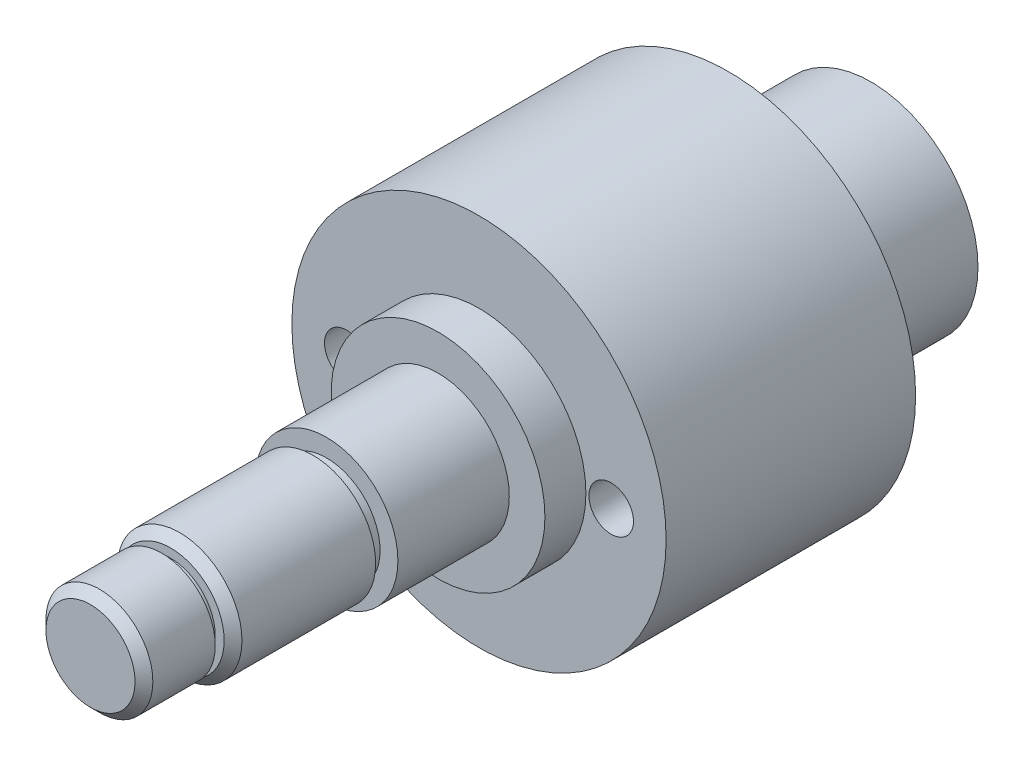
ISO-10303-21;
HEADER;
FILE_DESCRIPTION(('STEP AP214'),'2;1');
FILE_NAME('part.step','',(''),(''),'','','');
FILE_SCHEMA(('AUTOMOTIVE_DESIGN { 1 0 10303 214 1 1 1 1 }'));
ENDSEC;
DATA;
#1=APPLICATION_CONTEXT('core data for automotive mechanical design processes');
#2=APPLICATION_PROTOCOL_DEFINITION('international standard','automotive_design',2000,#1);
#3=PRODUCT_CONTEXT('',#1,'mechanical');
#4=PRODUCT('Part','Part','',(#3));
#5=PRODUCT_RELATED_PRODUCT_CATEGORY('part','',(#4));
#6=PRODUCT_DEFINITION_FORMATION('','',#4);
#7=PRODUCT_DEFINITION_CONTEXT('part definition',#1,'design');
#8=PRODUCT_DEFINITION('design','',#6,#7);
#9=PRODUCT_DEFINITION_SHAPE('','',#8);
#10=(LENGTH_UNIT() NAMED_UNIT(*) SI_UNIT(.MILLI.,.METRE.));
#11=(NAMED_UNIT(*) PLANE_ANGLE_UNIT() SI_UNIT($,.RADIAN.));
#12=(NAMED_UNIT(*) SI_UNIT($,.STERADIAN.) SOLID_ANGLE_UNIT());
#13=UNCERTAINTY_MEASURE_WITH_UNIT(LENGTH_MEASURE(1.E-05),#10,'distance_accuracy_value','');
#14=(GEOMETRIC_REPRESENTATION_CONTEXT(3) GLOBAL_UNCERTAINTY_ASSIGNED_CONTEXT((#13)) GLOBAL_UNIT_ASSIGNED_CONTEXT((#10,
#11,#12)) REPRESENTATION_CONTEXT('',''));
#15=CARTESIAN_POINT('',(0.,0.,0.));
#16=DIRECTION('',(0.,0.,1.));
#17=DIRECTION('',(1.,0.,0.));
#18=AXIS2_PLACEMENT_3D('',#15,#16,#17);
#19=CARTESIAN_POINT('',(0.,0.,8.));
#20=DIRECTION('',(0.,0.,-1.));
#21=DIRECTION('',(-1.,0.,0.));
#22=AXIS2_PLACEMENT_3D('',#19,#20,#21);
#23=CYLINDRICAL_SURFACE('',#22,6.);
#24=CARTESIAN_POINT('',(0.,0.,8.));
#25=DIRECTION('',(0.,0.,1.));
#26=DIRECTION('',(1.,0.,0.));
#27=AXIS2_PLACEMENT_3D('',#24,#25,#26);
#28=CIRCLE('',#27,6.);
#29=CARTESIAN_POINT('',(6.,0.,8.));
#30=VERTEX_POINT('',#29);
#31=EDGE_CURVE('E67',#30,#30,#28,.T.);
#32=ORIENTED_EDGE('',*,*,#31,.F.);
#33=EDGE_LOOP('',(#32));
#34=FACE_BOUND('',#33,.T.);
#35=CARTESIAN_POINT('',(0.,0.,0.));
#36=DIRECTION('',(0.,0.,1.));
#37=DIRECTION('',(1.,0.,0.));
#38=AXIS2_PLACEMENT_3D('',#35,#36,#37);
#39=CIRCLE('',#38,6.);
#40=CARTESIAN_POINT('',(6.,0.,0.));
#41=VERTEX_POINT('',#40);
#42=EDGE_CURVE('E64',#41,#41,#39,.T.);
#43=ORIENTED_EDGE('',*,*,#42,.T.);
#44=EDGE_LOOP('',(#43));
#45=FACE_BOUND('',#44,.T.);
#46=ADVANCED_FACE('F42',(#34,#45),#23,.T.);
#47=CARTESIAN_POINT('',(0.,0.,0.));
#48=DIRECTION('',(0.,0.,1.));
#49=DIRECTION('',(1.,0.,0.));
#50=AXIS2_PLACEMENT_3D('',#47,#48,#49);
#51=PLANE('',#50);
#52=CARTESIAN_POINT('',(0.,0.,0.));
#53=DIRECTION('',(0.,0.,-1.));
#54=DIRECTION('',(-1.,0.,0.));
#55=AXIS2_PLACEMENT_3D('',#52,#53,#54);
#56=CIRCLE('',#55,4.75);
#57=CARTESIAN_POINT('',(-4.75,0.,0.));
#58=VERTEX_POINT('',#57);
#59=EDGE_CURVE('E118',#58,#58,#56,.T.);
#60=ORIENTED_EDGE('',*,*,#59,.F.);
#61=EDGE_LOOP('',(#60));
#62=FACE_BOUND('',#61,.T.);
#63=ORIENTED_EDGE('',*,*,#42,.F.);
#64=EDGE_LOOP('',(#63));
#65=FACE_BOUND('',#64,.T.);
#66=ADVANCED_FACE('F133',(#62,#65),#51,.F.);
#67=CARTESIAN_POINT('',(0.,0.,22.));
#68=DIRECTION('',(0.,0.,1.));
#69=DIRECTION('',(1.,0.,0.));
#70=AXIS2_PLACEMENT_3D('',#67,#68,#69);
#71=PLANE('',#70);
#72=CARTESIAN_POINT('',(0.,0.,22.));
#73=DIRECTION('',(0.,0.,1.));
#74=DIRECTION('',(1.,0.,0.));
#75=AXIS2_PLACEMENT_3D('',#72,#73,#74);
#76=CIRCLE('',#75,6.);
#77=CARTESIAN_POINT('',(6.,0.,22.));
#78=VERTEX_POINT('',#77);
#79=EDGE_CURVE('E90',#78,#78,#76,.T.);
#80=ORIENTED_EDGE('',*,*,#79,.F.);
#81=EDGE_LOOP('',(#80));
#82=FACE_BOUND('',#81,.T.);
#83=CARTESIAN_POINT('',(-7.41856783886479,-0.0265898488848205,22.));
#84=DIRECTION('',(0.,0.,1.));
#85=DIRECTION('',(1.,0.,0.));
#86=AXIS2_PLACEMENT_3D('',#83,#84,#85);
#87=CIRCLE('',#86,1.25);
#88=CARTESIAN_POINT('',(-6.16856783886479,-0.0265898488848205,22.));
#89=VERTEX_POINT('',#88);
#90=EDGE_CURVE('E75',#89,#89,#87,.T.);
#91=ORIENTED_EDGE('',*,*,#90,.F.);
#92=EDGE_LOOP('',(#91));
#93=FACE_BOUND('',#92,.T.);
#94=CARTESIAN_POINT('',(0.,0.,22.));
#95=DIRECTION('',(0.,0.,1.));
#96=DIRECTION('',(1.,0.,0.));
#97=AXIS2_PLACEMENT_3D('',#94,#95,#96);
#98=CIRCLE('',#97,10.5);
#99=CARTESIAN_POINT('',(10.5,0.,22.));
#100=VERTEX_POINT('',#99);
#101=EDGE_CURVE('E68',#100,#100,#98,.T.);
#102=ORIENTED_EDGE('',*,*,#101,.T.);
#103=EDGE_LOOP('',(#102));
#104=FACE_BOUND('',#103,.T.);
#105=CARTESIAN_POINT('',(7.41856783886479,-0.0265898488848188,22.));
#106=DIRECTION('',(0.,0.,1.));
#107=DIRECTION('',(1.,0.,0.));
#108=AXIS2_PLACEMENT_3D('',#105,#106,#107);
#109=CIRCLE('',#108,1.25);
#110=CARTESIAN_POINT('',(8.66856783886479,-0.0265898488848188,22.));
#111=VERTEX_POINT('',#110);
#112=EDGE_CURVE('E81',#111,#111,#109,.T.);
#113=ORIENTED_EDGE('',*,*,#112,.F.);
#114=EDGE_LOOP('',(#113));
#115=FACE_BOUND('',#114,.T.);
#116=ADVANCED_FACE('F136',(#82,#93,#104,#115),#71,.T.);
#117=CARTESIAN_POINT('',(0.,0.,8.));
#118=DIRECTION('',(0.,0.,1.));
#119=DIRECTION('',(1.,0.,0.));
#120=AXIS2_PLACEMENT_3D('',#117,#118,#119);
#121=PLANE('',#120);
#122=ORIENTED_EDGE('',*,*,#31,.T.);
#123=EDGE_LOOP('',(#122));
#124=FACE_BOUND('',#123,.T.);
#125=CARTESIAN_POINT('',(0.,0.,8.));
#126=DIRECTION('',(0.,0.,1.));
#127=DIRECTION('',(1.,0.,0.));
#128=AXIS2_PLACEMENT_3D('',#125,#126,#127);
#129=CIRCLE('',#128,10.5);
#130=CARTESIAN_POINT('',(10.5,0.,8.));
#131=VERTEX_POINT('',#130);
#132=EDGE_CURVE('E72',#131,#131,#129,.T.);
#133=ORIENTED_EDGE('',*,*,#132,.F.);
#134=EDGE_LOOP('',(#133));
#135=FACE_BOUND('',#134,.T.);
#136=CARTESIAN_POINT('',(-7.41856783886479,-0.0265898488848205,8.));
#137=DIRECTION('',(0.,0.,1.));
#138=DIRECTION('',(1.,0.,0.));
#139=AXIS2_PLACEMENT_3D('',#136,#137,#138);
#140=CIRCLE('',#139,1.25);
#141=CARTESIAN_POINT('',(-6.16856783886479,-0.0265898488848205,8.));
#142=VERTEX_POINT('',#141);
#143=EDGE_CURVE('E78',#142,#142,#140,.T.);
#144=ORIENTED_EDGE('',*,*,#143,.T.);
#145=EDGE_LOOP('',(#144));
#146=FACE_BOUND('',#145,.T.);
#147=CARTESIAN_POINT('',(7.41856783886479,-0.0265898488848188,8.));
#148=DIRECTION('',(0.,0.,1.));
#149=DIRECTION('',(1.,0.,0.));
#150=AXIS2_PLACEMENT_3D('',#147,#148,#149);
#151=CIRCLE('',#150,1.25);
#152=CARTESIAN_POINT('',(8.66856783886479,-0.0265898488848188,8.));
#153=VERTEX_POINT('',#152);
#154=EDGE_CURVE('E84',#153,#153,#151,.T.);
#155=ORIENTED_EDGE('',*,*,#154,.T.);
#156=EDGE_LOOP('',(#155));
#157=FACE_BOUND('',#156,.T.);
#158=ADVANCED_FACE('F223',(#124,#135,#146,#157),#121,.F.);
#159=CARTESIAN_POINT('',(0.,0.,22.));
#160=DIRECTION('',(0.,0.,-1.));
#161=DIRECTION('',(-1.,0.,0.));
#162=AXIS2_PLACEMENT_3D('',#159,#160,#161);
#163=CYLINDRICAL_SURFACE('',#162,10.5);
#164=ORIENTED_EDGE('',*,*,#101,.F.);
#165=EDGE_LOOP('',(#164));
#166=FACE_BOUND('',#165,.T.);
#167=ORIENTED_EDGE('',*,*,#132,.T.);
#168=EDGE_LOOP('',(#167));
#169=FACE_BOUND('',#168,.T.);
#170=ADVANCED_FACE('F219',(#166,#169),#163,.T.);
#171=CARTESIAN_POINT('',(-7.41856783886479,-0.0265898488848205,22.));
#172=DIRECTION('',(0.,0.,-1.));
#173=DIRECTION('',(-1.,0.,0.));
#174=AXIS2_PLACEMENT_3D('',#171,#172,#173);
#175=CYLINDRICAL_SURFACE('',#174,1.25);
#176=ORIENTED_EDGE('',*,*,#90,.T.);
#177=EDGE_LOOP('',(#176));
#178=FACE_BOUND('',#177,.T.);
#179=ORIENTED_EDGE('',*,*,#143,.F.);
#180=EDGE_LOOP('',(#179));
#181=FACE_BOUND('',#180,.T.);
#182=ADVANCED_FACE('F215',(#178,#181),#175,.F.);
#183=CARTESIAN_POINT('',(7.41856783886479,-0.0265898488848188,22.));
#184=DIRECTION('',(0.,0.,-1.));
#185=DIRECTION('',(-1.,0.,0.));
#186=AXIS2_PLACEMENT_3D('',#183,#184,#185);
#187=CYLINDRICAL_SURFACE('',#186,1.25);
#188=ORIENTED_EDGE('',*,*,#112,.T.);
#189=EDGE_LOOP('',(#188));
#190=FACE_BOUND('',#189,.T.);
#191=ORIENTED_EDGE('',*,*,#154,.F.);
#192=EDGE_LOOP('',(#191));
#193=FACE_BOUND('',#192,.T.);
#194=ADVANCED_FACE('F211',(#190,#193),#187,.F.);
#195=CARTESIAN_POINT('',(0.,0.,24.3));
#196=DIRECTION('',(0.,0.,-1.));
#197=DIRECTION('',(-1.,0.,0.));
#198=AXIS2_PLACEMENT_3D('',#195,#196,#197);
#199=CYLINDRICAL_SURFACE('',#198,6.);
#200=CARTESIAN_POINT('',(0.,0.,24.3));
#201=DIRECTION('',(0.,0.,1.));
#202=DIRECTION('',(1.,0.,0.));
#203=AXIS2_PLACEMENT_3D('',#200,#201,#202);
#204=CIRCLE('',#203,6.);
#205=CARTESIAN_POINT('',(6.,0.,24.3));
#206=VERTEX_POINT('',#205);
#207=EDGE_CURVE('E87',#206,#206,#204,.T.);
#208=ORIENTED_EDGE('',*,*,#207,.F.);
#209=EDGE_LOOP('',(#208));
#210=FACE_BOUND('',#209,.T.);
#211=ORIENTED_EDGE('',*,*,#79,.T.);
#212=EDGE_LOOP('',(#211));
#213=FACE_BOUND('',#212,.T.);
#214=ADVANCED_FACE('F207',(#210,#213),#199,.T.);
#215=CARTESIAN_POINT('',(0.,0.,24.3));
#216=DIRECTION('',(0.,0.,1.));
#217=DIRECTION('',(1.,0.,0.));
#218=AXIS2_PLACEMENT_3D('',#215,#216,#217);
#219=PLANE('',#218);
#220=CARTESIAN_POINT('',(0.,0.,24.3));
#221=DIRECTION('',(0.,0.,1.));
#222=DIRECTION('',(1.,0.,0.));
#223=AXIS2_PLACEMENT_3D('',#220,#221,#222);
#224=CIRCLE('',#223,4.);
#225=CARTESIAN_POINT('',(4.,0.,24.3));
#226=VERTEX_POINT('',#225);
#227=EDGE_CURVE('E71',#226,#226,#224,.T.);
#228=ORIENTED_EDGE('',*,*,#227,.F.);
#229=EDGE_LOOP('',(#228));
#230=FACE_BOUND('',#229,.T.);
#231=ORIENTED_EDGE('',*,*,#207,.T.);
#232=EDGE_LOOP('',(#231));
#233=FACE_BOUND('',#232,.T.);
#234=ADVANCED_FACE('F203',(#230,#233),#219,.T.);
#235=CARTESIAN_POINT('',(0.,0.,30.55));
#236=DIRECTION('',(0.,0.,-1.));
#237=DIRECTION('',(-1.,0.,0.));
#238=AXIS2_PLACEMENT_3D('',#235,#236,#237);
#239=CYLINDRICAL_SURFACE('',#238,4.);
#240=CARTESIAN_POINT('',(0.,0.,30.55));
#241=DIRECTION('',(0.,0.,1.));
#242=DIRECTION('',(1.,0.,0.));
#243=AXIS2_PLACEMENT_3D('',#240,#241,#242);
#244=CIRCLE('',#243,4.);
#245=CARTESIAN_POINT('',(4.,0.,30.55));
#246=VERTEX_POINT('',#245);
#247=EDGE_CURVE('E93',#246,#246,#244,.T.);
#248=ORIENTED_EDGE('',*,*,#247,.F.);
#249=EDGE_LOOP('',(#248));
#250=FACE_BOUND('',#249,.T.);
#251=ORIENTED_EDGE('',*,*,#227,.T.);
#252=EDGE_LOOP('',(#251));
#253=FACE_BOUND('',#252,.T.);
#254=ADVANCED_FACE('F199',(#250,#253),#239,.T.);
#255=CARTESIAN_POINT('',(0.,0.,30.55));
#256=DIRECTION('',(0.,0.,1.));
#257=DIRECTION('',(1.,0.,0.));
#258=AXIS2_PLACEMENT_3D('',#255,#256,#257);
#259=PLANE('',#258);
#260=CARTESIAN_POINT('',(0.,0.,30.55));
#261=DIRECTION('',(0.,0.,1.));
#262=DIRECTION('',(1.,0.,0.));
#263=AXIS2_PLACEMENT_3D('',#260,#261,#262);
#264=CIRCLE('',#263,3.);
#265=CARTESIAN_POINT('',(3.,0.,30.55));
#266=VERTEX_POINT('',#265);
#267=EDGE_CURVE('E98',#266,#266,#264,.T.);
#268=ORIENTED_EDGE('',*,*,#267,.F.);
#269=EDGE_LOOP('',(#268));
#270=FACE_BOUND('',#269,.T.);
#271=ORIENTED_EDGE('',*,*,#247,.T.);
#272=EDGE_LOOP('',(#271));
#273=FACE_BOUND('',#272,.T.);
#274=ADVANCED_FACE('F195',(#270,#273),#259,.T.);
#275=CARTESIAN_POINT('',(0.,0.,31.3));
#276=DIRECTION('',(0.,0.,-1.));
#277=DIRECTION('',(-1.,0.,0.));
#278=AXIS2_PLACEMENT_3D('',#275,#276,#277);
#279=CYLINDRICAL_SURFACE('',#278,3.);
#280=CARTESIAN_POINT('',(0.,0.,31.3));
#281=DIRECTION('',(0.,0.,1.));
#282=DIRECTION('',(1.,0.,0.));
#283=AXIS2_PLACEMENT_3D('',#280,#281,#282);
#284=CIRCLE('',#283,3.);
#285=CARTESIAN_POINT('',(3.,0.,31.3));
#286=VERTEX_POINT('',#285);
#287=EDGE_CURVE('E101',#286,#286,#284,.T.);
#288=ORIENTED_EDGE('',*,*,#287,.F.);
#289=EDGE_LOOP('',(#288));
#290=FACE_BOUND('',#289,.T.);
#291=ORIENTED_EDGE('',*,*,#267,.T.);
#292=EDGE_LOOP('',(#291));
#293=FACE_BOUND('',#292,.T.);
#294=ADVANCED_FACE('F191',(#290,#293),#279,.T.);
#295=CARTESIAN_POINT('',(0.,0.,39.3));
#296=DIRECTION('',(0.,0.,-1.));
#297=DIRECTION('',(-1.,0.,0.));
#298=AXIS2_PLACEMENT_3D('',#295,#296,#297);
#299=CYLINDRICAL_SURFACE('',#298,3.5);
#300=CARTESIAN_POINT('',(0.,0.,38.8));
#301=DIRECTION('',(0.,0.,1.));
#302=DIRECTION('',(1.,0.,0.));
#303=AXIS2_PLACEMENT_3D('',#300,#301,#302);
#304=CIRCLE('',#303,3.5);
#305=CARTESIAN_POINT('',(3.5,0.,38.8));
#306=VERTEX_POINT('',#305);
#307=EDGE_CURVE('E54',#306,#306,#304,.F.);
#308=ORIENTED_EDGE('',*,*,#307,.T.);
#309=EDGE_LOOP('',(#308));
#310=FACE_BOUND('',#309,.T.);
#311=CARTESIAN_POINT('',(0.,0.,31.3));
#312=DIRECTION('',(0.,0.,1.));
#313=DIRECTION('',(1.,0.,0.));
#314=AXIS2_PLACEMENT_3D('',#311,#312,#313);
#315=CIRCLE('',#314,3.5);
#316=CARTESIAN_POINT('',(3.5,0.,31.3));
#317=VERTEX_POINT('',#316);
#318=EDGE_CURVE('E106',#317,#317,#315,.T.);
#319=ORIENTED_EDGE('',*,*,#318,.T.);
#320=EDGE_LOOP('',(#319));
#321=FACE_BOUND('',#320,.T.);
#322=ADVANCED_FACE('F169',(#310,#321),#299,.T.);
#323=CARTESIAN_POINT('',(0.,0.,39.3));
#324=DIRECTION('',(0.,0.,1.));
#325=DIRECTION('',(1.,0.,0.));
#326=AXIS2_PLACEMENT_3D('',#323,#324,#325);
#327=PLANE('',#326);
#328=CARTESIAN_POINT('',(0.,0.,39.3));
#329=DIRECTION('',(0.,0.,1.));
#330=DIRECTION('',(1.,0.,0.));
#331=AXIS2_PLACEMENT_3D('',#328,#329,#330);
#332=CIRCLE('',#331,3.);
#333=CARTESIAN_POINT('',(3.,0.,39.3));
#334=VERTEX_POINT('',#333);
#335=EDGE_CURVE('E58',#334,#334,#332,.T.);
#336=ORIENTED_EDGE('',*,*,#335,.T.);
#337=EDGE_LOOP('',(#336));
#338=FACE_BOUND('',#337,.T.);
#339=CARTESIAN_POINT('',(0.,0.,39.3));
#340=DIRECTION('',(0.,0.,1.));
#341=DIRECTION('',(1.,0.,0.));
#342=AXIS2_PLACEMENT_3D('',#339,#340,#341);
#343=CIRCLE('',#342,2.5);
#344=CARTESIAN_POINT('',(2.5,0.,39.3));
#345=VERTEX_POINT('',#344);
#346=EDGE_CURVE('E63',#345,#345,#343,.T.);
#347=ORIENTED_EDGE('',*,*,#346,.F.);
#348=EDGE_LOOP('',(#347));
#349=FACE_BOUND('',#348,.T.);
#350=ADVANCED_FACE('F166',(#338,#349),#327,.T.);
#351=CARTESIAN_POINT('',(0.,0.,31.3));
#352=DIRECTION('',(0.,0.,1.));
#353=DIRECTION('',(1.,0.,0.));
#354=AXIS2_PLACEMENT_3D('',#351,#352,#353);
#355=PLANE('',#354);
#356=ORIENTED_EDGE('',*,*,#287,.T.);
#357=EDGE_LOOP('',(#356));
#358=FACE_BOUND('',#357,.T.);
#359=ORIENTED_EDGE('',*,*,#318,.F.);
#360=EDGE_LOOP('',(#359));
#361=FACE_BOUND('',#360,.T.);
#362=ADVANCED_FACE('F168',(#358,#361),#355,.F.);
#363=CARTESIAN_POINT('',(0.,0.,39.8));
#364=DIRECTION('',(0.,0.,-1.));
#365=DIRECTION('',(-1.,0.,0.));
#366=AXIS2_PLACEMENT_3D('',#363,#364,#365);
#367=CYLINDRICAL_SURFACE('',#366,2.5);
#368=CARTESIAN_POINT('',(0.,0.,39.8));
#369=DIRECTION('',(0.,0.,1.));
#370=DIRECTION('',(1.,0.,0.));
#371=AXIS2_PLACEMENT_3D('',#368,#369,#370);
#372=CIRCLE('',#371,2.5);
#373=CARTESIAN_POINT('',(2.5,0.,39.8));
#374=VERTEX_POINT('',#373);
#375=EDGE_CURVE('E109',#374,#374,#372,.T.);
#376=ORIENTED_EDGE('',*,*,#375,.F.);
#377=EDGE_LOOP('',(#376));
#378=FACE_BOUND('',#377,.T.);
#379=ORIENTED_EDGE('',*,*,#346,.T.);
#380=EDGE_LOOP('',(#379));
#381=FACE_BOUND('',#380,.T.);
#382=ADVANCED_FACE('F173',(#378,#381),#367,.T.);
#383=CARTESIAN_POINT('',(0.,0.,43.8));
#384=DIRECTION('',(0.,0.,-1.));
#385=DIRECTION('',(-1.,0.,0.));
#386=AXIS2_PLACEMENT_3D('',#383,#384,#385);
#387=CYLINDRICAL_SURFACE('',#386,3.);
#388=CARTESIAN_POINT('',(0.,0.,43.3));
#389=DIRECTION('',(0.,0.,1.));
#390=DIRECTION('',(1.,0.,0.));
#391=AXIS2_PLACEMENT_3D('',#388,#389,#390);
#392=CIRCLE('',#391,3.);
#393=CARTESIAN_POINT('',(3.,0.,43.3));
#394=VERTEX_POINT('',#393);
#395=EDGE_CURVE('E10',#394,#394,#392,.F.);
#396=ORIENTED_EDGE('',*,*,#395,.T.);
#397=EDGE_LOOP('',(#396));
#398=FACE_BOUND('',#397,.T.);
#399=CARTESIAN_POINT('',(0.,0.,39.8));
#400=DIRECTION('',(0.,0.,1.));
#401=DIRECTION('',(1.,0.,0.));
#402=AXIS2_PLACEMENT_3D('',#399,#400,#401);
#403=CIRCLE('',#402,3.);
#404=CARTESIAN_POINT('',(3.,0.,39.8));
#405=VERTEX_POINT('',#404);
#406=EDGE_CURVE('E114',#405,#405,#403,.T.);
#407=ORIENTED_EDGE('',*,*,#406,.T.);
#408=EDGE_LOOP('',(#407));
#409=FACE_BOUND('',#408,.T.);
#410=ADVANCED_FACE('F175',(#398,#409),#387,.T.);
#411=CARTESIAN_POINT('',(0.,0.,43.8));
#412=DIRECTION('',(0.,0.,1.));
#413=DIRECTION('',(1.,0.,0.));
#414=AXIS2_PLACEMENT_3D('',#411,#412,#413);
#415=PLANE('',#414);
#416=CARTESIAN_POINT('',(0.,0.,43.8));
#417=DIRECTION('',(0.,0.,1.));
#418=DIRECTION('',(1.,0.,0.));
#419=AXIS2_PLACEMENT_3D('',#416,#417,#418);
#420=CIRCLE('',#419,2.5);
#421=CARTESIAN_POINT('',(2.5,0.,43.8));
#422=VERTEX_POINT('',#421);
#423=EDGE_CURVE('E50',#422,#422,#420,.T.);
#424=ORIENTED_EDGE('',*,*,#423,.T.);
#425=EDGE_LOOP('',(#424));
#426=FACE_BOUND('',#425,.T.);
#427=ADVANCED_FACE('F182',(#426),#415,.T.);
#428=CARTESIAN_POINT('',(0.,0.,39.8));
#429=DIRECTION('',(0.,0.,1.));
#430=DIRECTION('',(1.,0.,0.));
#431=AXIS2_PLACEMENT_3D('',#428,#429,#430);
#432=PLANE('',#431);
#433=ORIENTED_EDGE('',*,*,#375,.T.);
#434=EDGE_LOOP('',(#433));
#435=FACE_BOUND('',#434,.T.);
#436=ORIENTED_EDGE('',*,*,#406,.F.);
#437=EDGE_LOOP('',(#436));
#438=FACE_BOUND('',#437,.T.);
#439=ADVANCED_FACE('F129',(#435,#438),#432,.F.);
#440=CARTESIAN_POINT('',(0.,0.,21.));
#441=DIRECTION('',(0.,0.,-1.));
#442=DIRECTION('',(-1.,0.,0.));
#443=AXIS2_PLACEMENT_3D('',#440,#441,#442);
#444=CYLINDRICAL_SURFACE('',#443,4.75);
#445=CARTESIAN_POINT('',(0.,0.,21.));
#446=DIRECTION('',(0.,0.,-1.));
#447=DIRECTION('',(-1.,0.,0.));
#448=AXIS2_PLACEMENT_3D('',#445,#446,#447);
#449=CIRCLE('',#448,4.75);
#450=CARTESIAN_POINT('',(-4.75,0.,21.));
#451=VERTEX_POINT('',#450);
#452=EDGE_CURVE('E117',#451,#451,#449,.T.);
#453=CARTESIAN_POINT('',(-4.75,0.,21.));
#454=CARTESIAN_POINT('',(-4.75,0.,20.78125));
#455=CARTESIAN_POINT('',(-4.75,0.,20.5625));
#456=CARTESIAN_POINT('',(-4.75,0.,20.125));
#457=CARTESIAN_POINT('',(-4.75,0.,19.90625));
#458=CARTESIAN_POINT('',(-4.75,0.,19.46875));
#459=CARTESIAN_POINT('',(-4.75,0.,19.25));
#460=CARTESIAN_POINT('',(-4.75,0.,18.8125));
#461=CARTESIAN_POINT('',(-4.75,0.,18.59375));
#462=CARTESIAN_POINT('',(-4.75,0.,18.15625));
#463=CARTESIAN_POINT('',(-4.75,0.,17.9375));
#464=CARTESIAN_POINT('',(-4.75,0.,17.5));
#465=CARTESIAN_POINT('',(-4.75,0.,17.28125));
#466=CARTESIAN_POINT('',(-4.75,0.,16.84375));
#467=CARTESIAN_POINT('',(-4.75,0.,16.625));
#468=CARTESIAN_POINT('',(-4.75,0.,16.1875));
#469=CARTESIAN_POINT('',(-4.75,0.,15.96875));
#470=CARTESIAN_POINT('',(-4.75,0.,15.53125));
#471=CARTESIAN_POINT('',(-4.75,0.,15.3125));
#472=CARTESIAN_POINT('',(-4.75,0.,14.875));
#473=CARTESIAN_POINT('',(-4.75,0.,14.65625));
#474=CARTESIAN_POINT('',(-4.75,0.,14.21875));
#475=CARTESIAN_POINT('',(-4.75,0.,14.));
#476=CARTESIAN_POINT('',(-4.75,0.,13.5625));
#477=CARTESIAN_POINT('',(-4.75,0.,13.34375));
#478=CARTESIAN_POINT('',(-4.75,0.,12.90625));
#479=CARTESIAN_POINT('',(-4.75,0.,12.6875));
#480=CARTESIAN_POINT('',(-4.75,0.,12.25));
#481=CARTESIAN_POINT('',(-4.75,0.,12.03125));
#482=CARTESIAN_POINT('',(-4.75,0.,11.59375));
#483=CARTESIAN_POINT('',(-4.75,0.,11.375));
#484=CARTESIAN_POINT('',(-4.75,0.,10.9375));
#485=CARTESIAN_POINT('',(-4.75,0.,10.71875));
#486=CARTESIAN_POINT('',(-4.75,0.,10.28125));
#487=CARTESIAN_POINT('',(-4.75,0.,10.0625));
#488=CARTESIAN_POINT('',(-4.75,0.,9.625));
#489=CARTESIAN_POINT('',(-4.75,0.,9.40625));
#490=CARTESIAN_POINT('',(-4.75,0.,8.96875));
#491=CARTESIAN_POINT('',(-4.75,0.,8.75));
#492=CARTESIAN_POINT('',(-4.75,0.,8.3125));
#493=CARTESIAN_POINT('',(-4.75,0.,8.09375));
#494=CARTESIAN_POINT('',(-4.75,0.,7.65625));
#495=CARTESIAN_POINT('',(-4.75,0.,7.4375));
#496=CARTESIAN_POINT('',(-4.75,0.,7.));
#497=CARTESIAN_POINT('',(-4.75,0.,6.78125));
#498=CARTESIAN_POINT('',(-4.75,0.,6.34375));
#499=CARTESIAN_POINT('',(-4.75,0.,6.125));
#500=CARTESIAN_POINT('',(-4.75,0.,5.6875));
#501=CARTESIAN_POINT('',(-4.75,0.,5.46875));
#502=CARTESIAN_POINT('',(-4.75,0.,5.03125));
#503=CARTESIAN_POINT('',(-4.75,0.,4.8125));
#504=CARTESIAN_POINT('',(-4.75,0.,4.375));
#505=CARTESIAN_POINT('',(-4.75,0.,4.15625));
#506=CARTESIAN_POINT('',(-4.75,0.,3.71875));
#507=CARTESIAN_POINT('',(-4.75,0.,3.5));
#508=CARTESIAN_POINT('',(-4.75,0.,3.0625));
#509=CARTESIAN_POINT('',(-4.75,0.,2.84375));
#510=CARTESIAN_POINT('',(-4.75,0.,2.40625));
#511=CARTESIAN_POINT('',(-4.75,0.,2.1875));
#512=CARTESIAN_POINT('',(-4.75,0.,1.75));
#513=CARTESIAN_POINT('',(-4.75,0.,1.53125));
#514=CARTESIAN_POINT('',(-4.75,0.,1.09375));
#515=CARTESIAN_POINT('',(-4.75,0.,0.875000000000001));
#516=CARTESIAN_POINT('',(-4.75,0.,0.4375));
#517=CARTESIAN_POINT('',(-4.75,0.,0.21875));
#518=CARTESIAN_POINT('',(-4.75,0.,0.));
#519=B_SPLINE_CURVE_WITH_KNOTS('',3,(#453,#454,#455,#456,#457,#458,#459,#460,#461,#462,#463,
#464,#465,#466,#467,#468,#469,#470,#471,#472,#473,#474,#475,#476,#477,#478,#479,#480,#481,#482,
#483,#484,#485,#486,#487,#488,#489,#490,#491,#492,#493,#494,#495,#496,#497,#498,#499,#500,#501,
#502,#503,#504,#505,#506,#507,#508,#509,#510,#511,#512,#513,#514,#515,#516,#517,#518),
.UNSPECIFIED.,.F.,.F.,(4,2,2,2,2,2,2,2,2,2,2,2,2,2,2,2,2,2,2,2,2,2,2,2,2,2,2,2,2,2,2,2,4),(0.,
0.656249999999997,1.3125,1.96875,2.625,3.28125,3.9375,4.59375,5.25,5.90625,6.5625,7.21875,7.875,
8.53125,9.1875,9.84375,10.5,11.15625,11.8125,12.46875,13.125,13.78125,14.4375,15.09375,15.75,
16.40625,17.0625,17.71875,18.375,19.03125,19.6875,20.34375,21.),.UNSPECIFIED.);
#520=EDGE_CURVE('BSEAM126',#451,#58,#519,.T.);
#521=ORIENTED_EDGE('',*,*,#452,.F.);
#522=ORIENTED_EDGE('',*,*,#59,.T.);
#523=ORIENTED_EDGE('',*,*,#520,.T.);
#524=ORIENTED_EDGE('',*,*,#520,.F.);
#525=EDGE_LOOP('',(#521,#523,#522,#524));
#526=FACE_BOUND('',#525,.T.);
#527=ADVANCED_FACE('F126',(#526),#444,.F.);
#528=CARTESIAN_POINT('',(0.,0.,21.));
#529=DIRECTION('',(0.,0.,-1.));
#530=DIRECTION('',(-1.,0.,0.));
#531=AXIS2_PLACEMENT_3D('',#528,#529,#530);
#532=PLANE('',#531);
#533=ORIENTED_EDGE('',*,*,#452,.T.);
#534=EDGE_LOOP('',(#533));
#535=FACE_BOUND('',#534,.T.);
#536=ADVANCED_FACE('F124',(#535),#532,.T.);
#537=CARTESIAN_POINT('',(0.,0.,39.3));
#538=DIRECTION('',(0.,0.,-1.));
#539=DIRECTION('',(-1.,0.,0.));
#540=AXIS2_PLACEMENT_3D('',#537,#538,#539);
#541=CONICAL_SURFACE('',#540,3.,0.785398163397445);
#542=ORIENTED_EDGE('',*,*,#307,.F.);
#543=EDGE_LOOP('',(#542));
#544=FACE_BOUND('',#543,.T.);
#545=ORIENTED_EDGE('',*,*,#335,.F.);
#546=EDGE_LOOP('',(#545));
#547=FACE_BOUND('',#546,.T.);
#548=ADVANCED_FACE('F149',(#544,#547),#541,.T.);
#549=CARTESIAN_POINT('',(0.,0.,43.8));
#550=DIRECTION('',(0.,0.,-1.));
#551=DIRECTION('',(-1.,0.,0.));
#552=AXIS2_PLACEMENT_3D('',#549,#550,#551);
#553=CONICAL_SURFACE('',#552,2.5,0.785398163397445);
#554=ORIENTED_EDGE('',*,*,#395,.F.);
#555=EDGE_LOOP('',(#554));
#556=FACE_BOUND('',#555,.T.);
#557=ORIENTED_EDGE('',*,*,#423,.F.);
#558=EDGE_LOOP('',(#557));
#559=FACE_BOUND('',#558,.T.);
#560=ADVANCED_FACE('F45',(#556,#559),#553,.T.);
#561=CLOSED_SHELL('',(#46,#66,#116,#158,#170,#182,#194,#214,#234,#254,#274,#294,#322,#350,#362,
#382,#410,#427,#439,#527,#536,#548,#560));
#562=MANIFOLD_SOLID_BREP('B2',#561);
#563=ADVANCED_BREP_SHAPE_REPRESENTATION('',(#18,#562),#14);
#564=SHAPE_DEFINITION_REPRESENTATION(#9,#563);
ENDSEC;
END-ISO-10303-21;
